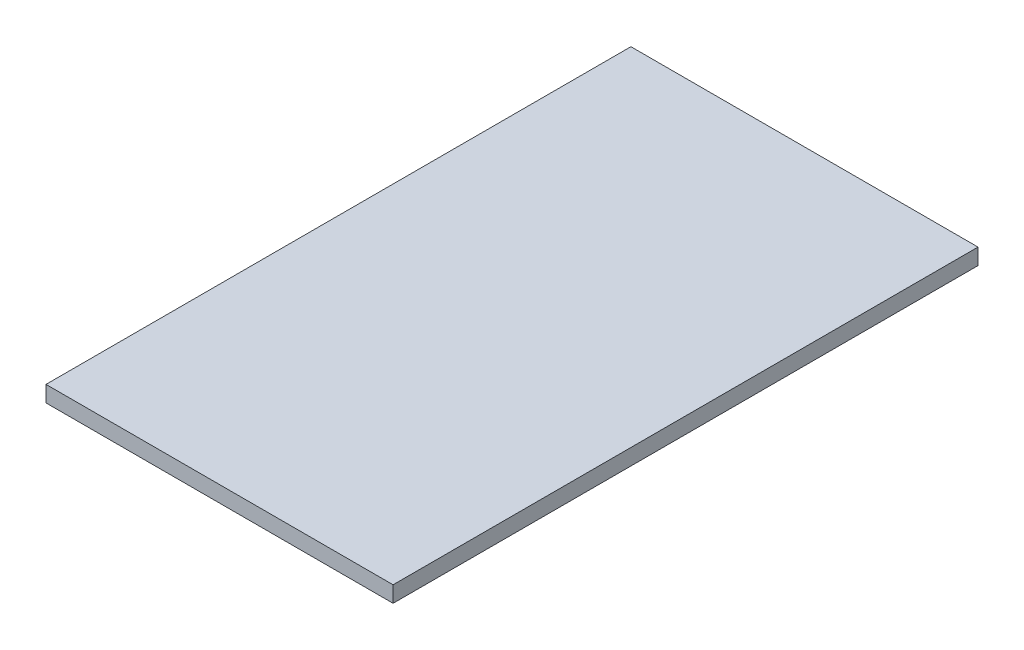
ISO-10303-21;
HEADER;
FILE_DESCRIPTION(('STEP AP214'),'2;1');
FILE_NAME('part.step','',(''),(''),'','','');
FILE_SCHEMA(('AUTOMOTIVE_DESIGN { 1 0 10303 214 1 1 1 1 }'));
ENDSEC;
DATA;
#1=APPLICATION_CONTEXT('core data for automotive mechanical design processes');
#2=APPLICATION_PROTOCOL_DEFINITION('international standard','automotive_design',2000,#1);
#3=PRODUCT_CONTEXT('',#1,'mechanical');
#4=PRODUCT('Part','Part','',(#3));
#5=PRODUCT_RELATED_PRODUCT_CATEGORY('part','',(#4));
#6=PRODUCT_DEFINITION_FORMATION('','',#4);
#7=PRODUCT_DEFINITION_CONTEXT('part definition',#1,'design');
#8=PRODUCT_DEFINITION('design','',#6,#7);
#9=PRODUCT_DEFINITION_SHAPE('','',#8);
#10=(LENGTH_UNIT() NAMED_UNIT(*) SI_UNIT(.MILLI.,.METRE.));
#11=(NAMED_UNIT(*) PLANE_ANGLE_UNIT() SI_UNIT($,.RADIAN.));
#12=(NAMED_UNIT(*) SI_UNIT($,.STERADIAN.) SOLID_ANGLE_UNIT());
#13=UNCERTAINTY_MEASURE_WITH_UNIT(LENGTH_MEASURE(1.E-05),#10,'distance_accuracy_value','');
#14=(GEOMETRIC_REPRESENTATION_CONTEXT(3) GLOBAL_UNCERTAINTY_ASSIGNED_CONTEXT((#13)) GLOBAL_UNIT_ASSIGNED_CONTEXT((#10,
#11,#12)) REPRESENTATION_CONTEXT('',''));
#15=CARTESIAN_POINT('',(0.,0.,0.));
#16=DIRECTION('',(0.,0.,1.));
#17=DIRECTION('',(1.,0.,0.));
#18=AXIS2_PLACEMENT_3D('',#15,#16,#17);
#19=CARTESIAN_POINT('',(27.,2.5,-45.5));
#20=DIRECTION('',(-1.,0.,0.));
#21=DIRECTION('',(0.,0.,1.));
#22=AXIS2_PLACEMENT_3D('',#19,#20,#21);
#23=PLANE('',#22);
#24=DIRECTION('',(0.,0.,-1.));
#25=VECTOR('',#24,1.);
#26=CARTESIAN_POINT('',(27.,0.,-45.5));
#27=LINE('',#26,#25);
#28=CARTESIAN_POINT('',(27.,0.,45.5));
#29=VERTEX_POINT('',#28);
#30=CARTESIAN_POINT('',(27.,0.,-45.5));
#31=VERTEX_POINT('',#30);
#32=EDGE_CURVE('E98',#29,#31,#27,.T.);
#33=ORIENTED_EDGE('',*,*,#32,.T.);
#34=DIRECTION('',(0.,-1.,0.));
#35=VECTOR('',#34,1.);
#36=CARTESIAN_POINT('',(27.,2.5,-45.5));
#37=LINE('',#36,#35);
#38=CARTESIAN_POINT('',(27.,2.5,-45.5));
#39=VERTEX_POINT('',#38);
#40=EDGE_CURVE('E11',#39,#31,#37,.T.);
#41=ORIENTED_EDGE('',*,*,#40,.F.);
#42=DIRECTION('',(0.,0.,-1.));
#43=VECTOR('',#42,1.);
#44=CARTESIAN_POINT('',(27.,2.5,-45.5));
#45=LINE('',#44,#43);
#46=CARTESIAN_POINT('',(27.,2.5,45.5));
#47=VERTEX_POINT('',#46);
#48=EDGE_CURVE('E86',#47,#39,#45,.T.);
#49=ORIENTED_EDGE('',*,*,#48,.F.);
#50=DIRECTION('',(0.,-1.,0.));
#51=VECTOR('',#50,1.);
#52=CARTESIAN_POINT('',(27.,2.5,45.5));
#53=LINE('',#52,#51);
#54=EDGE_CURVE('E94',#47,#29,#53,.T.);
#55=ORIENTED_EDGE('',*,*,#54,.T.);
#56=EDGE_LOOP('',(#33,#41,#49,#55));
#57=FACE_BOUND('',#56,.T.);
#58=ADVANCED_FACE('F35',(#57),#23,.F.);
#59=CARTESIAN_POINT('',(-27.,2.5,-45.5));
#60=DIRECTION('',(0.,0.,1.));
#61=DIRECTION('',(1.,0.,0.));
#62=AXIS2_PLACEMENT_3D('',#59,#60,#61);
#63=PLANE('',#62);
#64=DIRECTION('',(-1.,0.,0.));
#65=VECTOR('',#64,1.);
#66=CARTESIAN_POINT('',(-27.,0.,-45.5));
#67=LINE('',#66,#65);
#68=CARTESIAN_POINT('',(-27.,0.,-45.5));
#69=VERTEX_POINT('',#68);
#70=EDGE_CURVE('E90',#31,#69,#67,.T.);
#71=ORIENTED_EDGE('',*,*,#70,.T.);
#72=DIRECTION('',(0.,-1.,0.));
#73=VECTOR('',#72,1.);
#74=CARTESIAN_POINT('',(-27.,2.5,-45.5));
#75=LINE('',#74,#73);
#76=CARTESIAN_POINT('',(-27.,2.5,-45.5));
#77=VERTEX_POINT('',#76);
#78=EDGE_CURVE('E43',#77,#69,#75,.T.);
#79=ORIENTED_EDGE('',*,*,#78,.F.);
#80=DIRECTION('',(-1.,0.,0.));
#81=VECTOR('',#80,1.);
#82=CARTESIAN_POINT('',(-27.,2.5,-45.5));
#83=LINE('',#82,#81);
#84=EDGE_CURVE('E81',#39,#77,#83,.T.);
#85=ORIENTED_EDGE('',*,*,#84,.F.);
#86=ORIENTED_EDGE('',*,*,#40,.T.);
#87=EDGE_LOOP('',(#71,#79,#85,#86));
#88=FACE_BOUND('',#87,.T.);
#89=ADVANCED_FACE('F89',(#88),#63,.F.);
#90=CARTESIAN_POINT('',(-27.,2.5,-45.5));
#91=DIRECTION('',(1.,0.,0.));
#92=DIRECTION('',(0.,0.,-1.));
#93=AXIS2_PLACEMENT_3D('',#90,#91,#92);
#94=PLANE('',#93);
#95=DIRECTION('',(0.,0.,1.));
#96=VECTOR('',#95,1.);
#97=CARTESIAN_POINT('',(-27.,0.,-45.5));
#98=LINE('',#97,#96);
#99=CARTESIAN_POINT('',(-27.,0.,45.5));
#100=VERTEX_POINT('',#99);
#101=EDGE_CURVE('E68',#69,#100,#98,.T.);
#102=ORIENTED_EDGE('',*,*,#101,.T.);
#103=DIRECTION('',(0.,-1.,0.));
#104=VECTOR('',#103,1.);
#105=CARTESIAN_POINT('',(-27.,2.5,45.5));
#106=LINE('',#105,#104);
#107=CARTESIAN_POINT('',(-27.,2.5,45.5));
#108=VERTEX_POINT('',#107);
#109=EDGE_CURVE('E91',#108,#100,#106,.T.);
#110=ORIENTED_EDGE('',*,*,#109,.F.);
#111=DIRECTION('',(0.,0.,1.));
#112=VECTOR('',#111,1.);
#113=CARTESIAN_POINT('',(-27.,2.5,-45.5));
#114=LINE('',#113,#112);
#115=EDGE_CURVE('E84',#77,#108,#114,.T.);
#116=ORIENTED_EDGE('',*,*,#115,.F.);
#117=ORIENTED_EDGE('',*,*,#78,.T.);
#118=EDGE_LOOP('',(#102,#110,#116,#117));
#119=FACE_BOUND('',#118,.T.);
#120=ADVANCED_FACE('F92',(#119),#94,.F.);
#121=CARTESIAN_POINT('',(-27.,2.5,45.5));
#122=DIRECTION('',(0.,0.,-1.));
#123=DIRECTION('',(-1.,0.,0.));
#124=AXIS2_PLACEMENT_3D('',#121,#122,#123);
#125=PLANE('',#124);
#126=DIRECTION('',(1.,0.,0.));
#127=VECTOR('',#126,1.);
#128=CARTESIAN_POINT('',(-27.,0.,45.5));
#129=LINE('',#128,#127);
#130=EDGE_CURVE('E74',#100,#29,#129,.T.);
#131=ORIENTED_EDGE('',*,*,#130,.T.);
#132=ORIENTED_EDGE('',*,*,#54,.F.);
#133=DIRECTION('',(1.,0.,0.));
#134=VECTOR('',#133,1.);
#135=CARTESIAN_POINT('',(-27.,2.5,45.5));
#136=LINE('',#135,#134);
#137=EDGE_CURVE('E51',#108,#47,#136,.T.);
#138=ORIENTED_EDGE('',*,*,#137,.F.);
#139=ORIENTED_EDGE('',*,*,#109,.T.);
#140=EDGE_LOOP('',(#131,#132,#138,#139));
#141=FACE_BOUND('',#140,.T.);
#142=ADVANCED_FACE('F105',(#141),#125,.F.);
#143=CARTESIAN_POINT('',(0.,2.5,0.));
#144=DIRECTION('',(0.,1.,0.));
#145=DIRECTION('',(0.,0.,1.));
#146=AXIS2_PLACEMENT_3D('',#143,#144,#145);
#147=PLANE('',#146);
#148=ORIENTED_EDGE('',*,*,#48,.T.);
#149=ORIENTED_EDGE('',*,*,#84,.T.);
#150=ORIENTED_EDGE('',*,*,#115,.T.);
#151=ORIENTED_EDGE('',*,*,#137,.T.);
#152=EDGE_LOOP('',(#148,#149,#150,#151));
#153=FACE_BOUND('',#152,.T.);
#154=ADVANCED_FACE('F82',(#153),#147,.T.);
#155=CARTESIAN_POINT('',(0.,0.,0.));
#156=DIRECTION('',(0.,1.,0.));
#157=DIRECTION('',(0.,0.,1.));
#158=AXIS2_PLACEMENT_3D('',#155,#156,#157);
#159=PLANE('',#158);
#160=ORIENTED_EDGE('',*,*,#32,.F.);
#161=ORIENTED_EDGE('',*,*,#130,.F.);
#162=ORIENTED_EDGE('',*,*,#101,.F.);
#163=ORIENTED_EDGE('',*,*,#70,.F.);
#164=EDGE_LOOP('',(#160,#161,#162,#163));
#165=FACE_BOUND('',#164,.T.);
#166=ADVANCED_FACE('F108',(#165),#159,.F.);
#167=CLOSED_SHELL('',(#58,#89,#120,#142,#154,#166));
#168=MANIFOLD_SOLID_BREP('B2',#167);
#169=ADVANCED_BREP_SHAPE_REPRESENTATION('',(#18,#168),#14);
#170=SHAPE_DEFINITION_REPRESENTATION(#9,#169);
ENDSEC;
END-ISO-10303-21;
